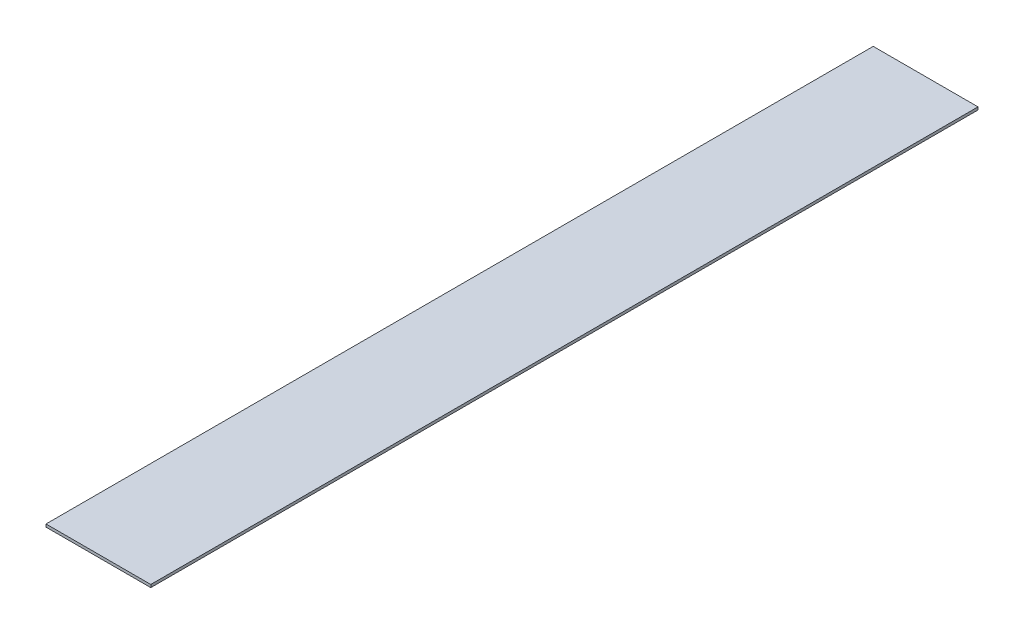
ISO-10303-21;
HEADER;
FILE_DESCRIPTION(('STEP AP214'),'2;1');
FILE_NAME('part.step','',(''),(''),'','','');
FILE_SCHEMA(('AUTOMOTIVE_DESIGN { 1 0 10303 214 1 1 1 1 }'));
ENDSEC;
DATA;
#1=APPLICATION_CONTEXT('core data for automotive mechanical design processes');
#2=APPLICATION_PROTOCOL_DEFINITION('international standard','automotive_design',2000,#1);
#3=PRODUCT_CONTEXT('',#1,'mechanical');
#4=PRODUCT('Part','Part','',(#3));
#5=PRODUCT_RELATED_PRODUCT_CATEGORY('part','',(#4));
#6=PRODUCT_DEFINITION_FORMATION('','',#4);
#7=PRODUCT_DEFINITION_CONTEXT('part definition',#1,'design');
#8=PRODUCT_DEFINITION('design','',#6,#7);
#9=PRODUCT_DEFINITION_SHAPE('','',#8);
#10=(LENGTH_UNIT() NAMED_UNIT(*) SI_UNIT(.MILLI.,.METRE.));
#11=(NAMED_UNIT(*) PLANE_ANGLE_UNIT() SI_UNIT($,.RADIAN.));
#12=(NAMED_UNIT(*) SI_UNIT($,.STERADIAN.) SOLID_ANGLE_UNIT());
#13=UNCERTAINTY_MEASURE_WITH_UNIT(LENGTH_MEASURE(1.E-05),#10,'distance_accuracy_value','');
#14=(GEOMETRIC_REPRESENTATION_CONTEXT(3) GLOBAL_UNCERTAINTY_ASSIGNED_CONTEXT((#13)) GLOBAL_UNIT_ASSIGNED_CONTEXT((#10,
#11,#12)) REPRESENTATION_CONTEXT('',''));
#15=CARTESIAN_POINT('',(0.,0.,0.));
#16=DIRECTION('',(0.,0.,1.));
#17=DIRECTION('',(1.,0.,0.));
#18=AXIS2_PLACEMENT_3D('',#15,#16,#17);
#19=CARTESIAN_POINT('',(0.,0.,150.));
#20=DIRECTION('',(1.,0.,0.));
#21=DIRECTION('',(0.,0.,-1.));
#22=AXIS2_PLACEMENT_3D('',#19,#20,#21);
#23=PLANE('',#22);
#24=DIRECTION('',(0.,-1.,0.));
#25=VECTOR('',#24,1.);
#26=CARTESIAN_POINT('',(0.,0.,0.));
#27=LINE('',#26,#25);
#28=CARTESIAN_POINT('',(0.,0.5,0.));
#29=VERTEX_POINT('',#28);
#30=CARTESIAN_POINT('',(0.,0.,0.));
#31=VERTEX_POINT('',#30);
#32=EDGE_CURVE('E99',#29,#31,#27,.T.);
#33=ORIENTED_EDGE('',*,*,#32,.T.);
#34=DIRECTION('',(0.,0.,-1.));
#35=VECTOR('',#34,1.);
#36=CARTESIAN_POINT('',(0.,0.,150.));
#37=LINE('',#36,#35);
#38=CARTESIAN_POINT('',(0.,0.,150.));
#39=VERTEX_POINT('',#38);
#40=EDGE_CURVE('E11',#39,#31,#37,.T.);
#41=ORIENTED_EDGE('',*,*,#40,.F.);
#42=DIRECTION('',(0.,-1.,0.));
#43=VECTOR('',#42,1.);
#44=CARTESIAN_POINT('',(0.,0.,150.));
#45=LINE('',#44,#43);
#46=CARTESIAN_POINT('',(0.,0.5,150.));
#47=VERTEX_POINT('',#46);
#48=EDGE_CURVE('E87',#47,#39,#45,.T.);
#49=ORIENTED_EDGE('',*,*,#48,.F.);
#50=DIRECTION('',(0.,0.,-1.));
#51=VECTOR('',#50,1.);
#52=CARTESIAN_POINT('',(0.,0.5,150.));
#53=LINE('',#52,#51);
#54=EDGE_CURVE('E95',#47,#29,#53,.T.);
#55=ORIENTED_EDGE('',*,*,#54,.T.);
#56=EDGE_LOOP('',(#33,#41,#49,#55));
#57=FACE_BOUND('',#56,.T.);
#58=ADVANCED_FACE('F36',(#57),#23,.F.);
#59=CARTESIAN_POINT('',(0.,0.,150.));
#60=DIRECTION('',(0.,1.,0.));
#61=DIRECTION('',(0.,0.,1.));
#62=AXIS2_PLACEMENT_3D('',#59,#60,#61);
#63=PLANE('',#62);
#64=DIRECTION('',(1.,0.,0.));
#65=VECTOR('',#64,1.);
#66=CARTESIAN_POINT('',(0.,0.,0.));
#67=LINE('',#66,#65);
#68=CARTESIAN_POINT('',(19.,0.,0.));
#69=VERTEX_POINT('',#68);
#70=EDGE_CURVE('E91',#31,#69,#67,.T.);
#71=ORIENTED_EDGE('',*,*,#70,.T.);
#72=DIRECTION('',(0.,0.,-1.));
#73=VECTOR('',#72,1.);
#74=CARTESIAN_POINT('',(19.,0.,150.));
#75=LINE('',#74,#73);
#76=CARTESIAN_POINT('',(19.,0.,150.));
#77=VERTEX_POINT('',#76);
#78=EDGE_CURVE('E44',#77,#69,#75,.T.);
#79=ORIENTED_EDGE('',*,*,#78,.F.);
#80=DIRECTION('',(1.,0.,0.));
#81=VECTOR('',#80,1.);
#82=CARTESIAN_POINT('',(0.,0.,150.));
#83=LINE('',#82,#81);
#84=EDGE_CURVE('E82',#39,#77,#83,.T.);
#85=ORIENTED_EDGE('',*,*,#84,.F.);
#86=ORIENTED_EDGE('',*,*,#40,.T.);
#87=EDGE_LOOP('',(#71,#79,#85,#86));
#88=FACE_BOUND('',#87,.T.);
#89=ADVANCED_FACE('F90',(#88),#63,.F.);
#90=CARTESIAN_POINT('',(19.,0.,150.));
#91=DIRECTION('',(-1.,0.,0.));
#92=DIRECTION('',(0.,0.,1.));
#93=AXIS2_PLACEMENT_3D('',#90,#91,#92);
#94=PLANE('',#93);
#95=DIRECTION('',(0.,1.,0.));
#96=VECTOR('',#95,1.);
#97=CARTESIAN_POINT('',(19.,0.,0.));
#98=LINE('',#97,#96);
#99=CARTESIAN_POINT('',(19.,0.5,0.));
#100=VERTEX_POINT('',#99);
#101=EDGE_CURVE('E69',#69,#100,#98,.T.);
#102=ORIENTED_EDGE('',*,*,#101,.T.);
#103=DIRECTION('',(0.,0.,-1.));
#104=VECTOR('',#103,1.);
#105=CARTESIAN_POINT('',(19.,0.5,150.));
#106=LINE('',#105,#104);
#107=CARTESIAN_POINT('',(19.,0.5,150.));
#108=VERTEX_POINT('',#107);
#109=EDGE_CURVE('E92',#108,#100,#106,.T.);
#110=ORIENTED_EDGE('',*,*,#109,.F.);
#111=DIRECTION('',(0.,1.,0.));
#112=VECTOR('',#111,1.);
#113=CARTESIAN_POINT('',(19.,0.,150.));
#114=LINE('',#113,#112);
#115=EDGE_CURVE('E85',#77,#108,#114,.T.);
#116=ORIENTED_EDGE('',*,*,#115,.F.);
#117=ORIENTED_EDGE('',*,*,#78,.T.);
#118=EDGE_LOOP('',(#102,#110,#116,#117));
#119=FACE_BOUND('',#118,.T.);
#120=ADVANCED_FACE('F93',(#119),#94,.F.);
#121=CARTESIAN_POINT('',(0.,0.5,150.));
#122=DIRECTION('',(0.,-1.,0.));
#123=DIRECTION('',(1.,0.,0.));
#124=AXIS2_PLACEMENT_3D('',#121,#122,#123);
#125=PLANE('',#124);
#126=DIRECTION('',(-1.,0.,0.));
#127=VECTOR('',#126,1.);
#128=CARTESIAN_POINT('',(0.,0.5,0.));
#129=LINE('',#128,#127);
#130=EDGE_CURVE('E75',#100,#29,#129,.T.);
#131=ORIENTED_EDGE('',*,*,#130,.T.);
#132=ORIENTED_EDGE('',*,*,#54,.F.);
#133=DIRECTION('',(-1.,0.,0.));
#134=VECTOR('',#133,1.);
#135=CARTESIAN_POINT('',(0.,0.5,150.));
#136=LINE('',#135,#134);
#137=EDGE_CURVE('E52',#108,#47,#136,.T.);
#138=ORIENTED_EDGE('',*,*,#137,.F.);
#139=ORIENTED_EDGE('',*,*,#109,.T.);
#140=EDGE_LOOP('',(#131,#132,#138,#139));
#141=FACE_BOUND('',#140,.T.);
#142=ADVANCED_FACE('F106',(#141),#125,.F.);
#143=CARTESIAN_POINT('',(0.,0.,150.));
#144=DIRECTION('',(0.,0.,-1.));
#145=DIRECTION('',(-1.,0.,0.));
#146=AXIS2_PLACEMENT_3D('',#143,#144,#145);
#147=PLANE('',#146);
#148=ORIENTED_EDGE('',*,*,#48,.T.);
#149=ORIENTED_EDGE('',*,*,#84,.T.);
#150=ORIENTED_EDGE('',*,*,#115,.T.);
#151=ORIENTED_EDGE('',*,*,#137,.T.);
#152=EDGE_LOOP('',(#148,#149,#150,#151));
#153=FACE_BOUND('',#152,.T.);
#154=ADVANCED_FACE('F83',(#153),#147,.F.);
#155=CARTESIAN_POINT('',(0.,0.,0.));
#156=DIRECTION('',(0.,0.,-1.));
#157=DIRECTION('',(-1.,0.,0.));
#158=AXIS2_PLACEMENT_3D('',#155,#156,#157);
#159=PLANE('',#158);
#160=ORIENTED_EDGE('',*,*,#32,.F.);
#161=ORIENTED_EDGE('',*,*,#130,.F.);
#162=ORIENTED_EDGE('',*,*,#101,.F.);
#163=ORIENTED_EDGE('',*,*,#70,.F.);
#164=EDGE_LOOP('',(#160,#161,#162,#163));
#165=FACE_BOUND('',#164,.T.);
#166=ADVANCED_FACE('F109',(#165),#159,.T.);
#167=CLOSED_SHELL('',(#58,#89,#120,#142,#154,#166));
#168=MANIFOLD_SOLID_BREP('B2',#167);
#169=ADVANCED_BREP_SHAPE_REPRESENTATION('',(#18,#168),#14);
#170=SHAPE_DEFINITION_REPRESENTATION(#9,#169);
ENDSEC;
END-ISO-10303-21;
